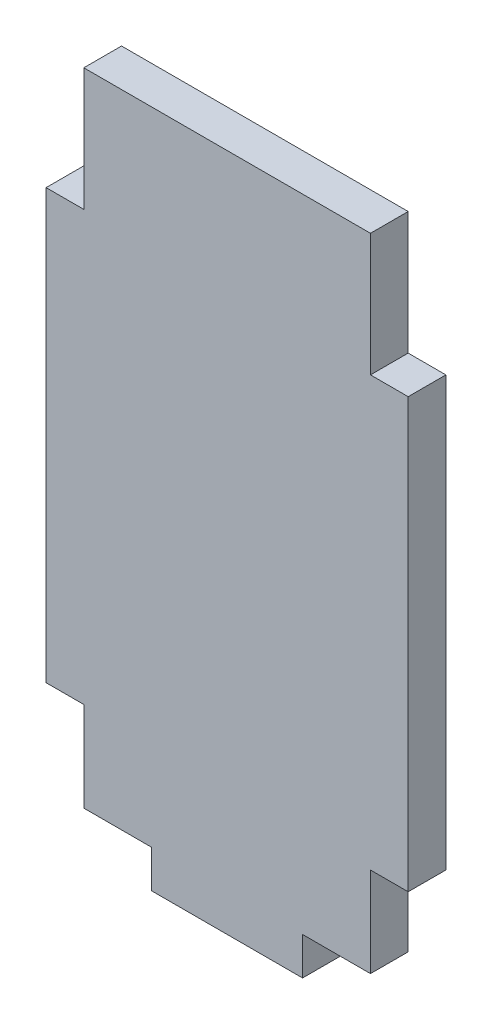
ISO-10303-21;
HEADER;
FILE_DESCRIPTION(('STEP AP214'),'2;1');
FILE_NAME('part.step','',(''),(''),'','','');
FILE_SCHEMA(('AUTOMOTIVE_DESIGN { 1 0 10303 214 1 1 1 1 }'));
ENDSEC;
DATA;
#1=APPLICATION_CONTEXT('core data for automotive mechanical design processes');
#2=APPLICATION_PROTOCOL_DEFINITION('international standard','automotive_design',2000,#1);
#3=PRODUCT_CONTEXT('',#1,'mechanical');
#4=PRODUCT('Part','Part','',(#3));
#5=PRODUCT_RELATED_PRODUCT_CATEGORY('part','',(#4));
#6=PRODUCT_DEFINITION_FORMATION('','',#4);
#7=PRODUCT_DEFINITION_CONTEXT('part definition',#1,'design');
#8=PRODUCT_DEFINITION('design','',#6,#7);
#9=PRODUCT_DEFINITION_SHAPE('','',#8);
#10=(LENGTH_UNIT() NAMED_UNIT(*) SI_UNIT(.MILLI.,.METRE.));
#11=(NAMED_UNIT(*) PLANE_ANGLE_UNIT() SI_UNIT($,.RADIAN.));
#12=(NAMED_UNIT(*) SI_UNIT($,.STERADIAN.) SOLID_ANGLE_UNIT());
#13=UNCERTAINTY_MEASURE_WITH_UNIT(LENGTH_MEASURE(1.E-05),#10,'distance_accuracy_value','');
#14=(GEOMETRIC_REPRESENTATION_CONTEXT(3) GLOBAL_UNCERTAINTY_ASSIGNED_CONTEXT((#13)) GLOBAL_UNIT_ASSIGNED_CONTEXT((#10,
#11,#12)) REPRESENTATION_CONTEXT('',''));
#15=CARTESIAN_POINT('',(0.,0.,0.));
#16=DIRECTION('',(0.,0.,1.));
#17=DIRECTION('',(1.,0.,0.));
#18=AXIS2_PLACEMENT_3D('',#15,#16,#17);
#19=CARTESIAN_POINT('',(0.,0.,5.));
#20=DIRECTION('',(1.,0.,0.));
#21=DIRECTION('',(0.,1.,0.));
#22=AXIS2_PLACEMENT_3D('',#19,#20,#21);
#23=PLANE('',#22);
#24=DIRECTION('',(0.,-1.,0.));
#25=VECTOR('',#24,1.);
#26=CARTESIAN_POINT('',(0.,0.,0.));
#27=LINE('',#26,#25);
#28=CARTESIAN_POINT('',(0.,13.643220338983,0.));
#29=VERTEX_POINT('',#28);
#30=CARTESIAN_POINT('',(0.,-2.61467439785904,0.));
#31=VERTEX_POINT('',#30);
#32=EDGE_CURVE('E176',#29,#31,#27,.T.);
#33=ORIENTED_EDGE('',*,*,#32,.F.);
#34=DIRECTION('',(0.,0.,-1.));
#35=VECTOR('',#34,1.);
#36=CARTESIAN_POINT('',(0.,13.643220338983,5.));
#37=LINE('',#36,#35);
#38=CARTESIAN_POINT('',(0.,13.643220338983,5.));
#39=VERTEX_POINT('',#38);
#40=EDGE_CURVE('E11',#39,#29,#37,.T.);
#41=ORIENTED_EDGE('',*,*,#40,.F.);
#42=DIRECTION('',(0.,-1.,0.));
#43=VECTOR('',#42,1.);
#44=CARTESIAN_POINT('',(0.,0.,5.));
#45=LINE('',#44,#43);
#46=CARTESIAN_POINT('',(0.,-2.61467439785904,5.));
#47=VERTEX_POINT('',#46);
#48=EDGE_CURVE('E211',#39,#47,#45,.T.);
#49=ORIENTED_EDGE('',*,*,#48,.T.);
#50=DIRECTION('',(0.,0.,-1.));
#51=VECTOR('',#50,1.);
#52=CARTESIAN_POINT('',(0.,-2.61467439785904,5.));
#53=LINE('',#52,#51);
#54=EDGE_CURVE('E110',#47,#31,#53,.T.);
#55=ORIENTED_EDGE('',*,*,#54,.T.);
#56=EDGE_LOOP('',(#33,#41,#49,#55));
#57=FACE_BOUND('',#56,.T.);
#58=ADVANCED_FACE('F35',(#57),#23,.T.);
#59=CARTESIAN_POINT('',(0.,13.643220338983,5.));
#60=DIRECTION('',(0.,1.,0.));
#61=DIRECTION('',(0.,0.,1.));
#62=AXIS2_PLACEMENT_3D('',#59,#60,#61);
#63=PLANE('',#62);
#64=DIRECTION('',(1.,0.,0.));
#65=VECTOR('',#64,1.);
#66=CARTESIAN_POINT('',(0.,13.643220338983,0.));
#67=LINE('',#66,#65);
#68=CARTESIAN_POINT('',(-38.,13.643220338983,0.));
#69=VERTEX_POINT('',#68);
#70=EDGE_CURVE('E179',#69,#29,#67,.T.);
#71=ORIENTED_EDGE('',*,*,#70,.F.);
#72=DIRECTION('',(0.,0.,-1.));
#73=VECTOR('',#72,1.);
#74=CARTESIAN_POINT('',(-38.,13.643220338983,5.));
#75=LINE('',#74,#73);
#76=CARTESIAN_POINT('',(-38.,13.643220338983,5.));
#77=VERTEX_POINT('',#76);
#78=EDGE_CURVE('E44',#77,#69,#75,.T.);
#79=ORIENTED_EDGE('',*,*,#78,.F.);
#80=DIRECTION('',(1.,0.,0.));
#81=VECTOR('',#80,1.);
#82=CARTESIAN_POINT('',(0.,13.643220338983,5.));
#83=LINE('',#82,#81);
#84=EDGE_CURVE('E252',#77,#39,#83,.T.);
#85=ORIENTED_EDGE('',*,*,#84,.T.);
#86=ORIENTED_EDGE('',*,*,#40,.T.);
#87=EDGE_LOOP('',(#71,#79,#85,#86));
#88=FACE_BOUND('',#87,.T.);
#89=ADVANCED_FACE('F37',(#88),#63,.T.);
#90=CARTESIAN_POINT('',(-38.,0.,5.));
#91=DIRECTION('',(1.,0.,0.));
#92=DIRECTION('',(0.,1.,0.));
#93=AXIS2_PLACEMENT_3D('',#90,#91,#92);
#94=PLANE('',#93);
#95=DIRECTION('',(0.,-1.,0.));
#96=VECTOR('',#95,1.);
#97=CARTESIAN_POINT('',(-38.,0.,0.));
#98=LINE('',#97,#96);
#99=CARTESIAN_POINT('',(-38.,-2.61467439785905,0.));
#100=VERTEX_POINT('',#99);
#101=EDGE_CURVE('E183',#69,#100,#98,.T.);
#102=ORIENTED_EDGE('',*,*,#101,.T.);
#103=DIRECTION('',(0.,0.,-1.));
#104=VECTOR('',#103,1.);
#105=CARTESIAN_POINT('',(-38.,-2.61467439785905,5.));
#106=LINE('',#105,#104);
#107=CARTESIAN_POINT('',(-38.,-2.61467439785905,5.));
#108=VERTEX_POINT('',#107);
#109=EDGE_CURVE('E236',#108,#100,#106,.T.);
#110=ORIENTED_EDGE('',*,*,#109,.F.);
#111=DIRECTION('',(0.,-1.,0.));
#112=VECTOR('',#111,1.);
#113=CARTESIAN_POINT('',(-38.,0.,5.));
#114=LINE('',#113,#112);
#115=EDGE_CURVE('E243',#77,#108,#114,.T.);
#116=ORIENTED_EDGE('',*,*,#115,.F.);
#117=ORIENTED_EDGE('',*,*,#78,.T.);
#118=EDGE_LOOP('',(#102,#110,#116,#117));
#119=FACE_BOUND('',#118,.T.);
#120=ADVANCED_FACE('F241',(#119),#94,.F.);
#121=CARTESIAN_POINT('',(0.,-2.61467439785904,5.));
#122=DIRECTION('',(0.,-1.,0.));
#123=DIRECTION('',(1.,0.,0.));
#124=AXIS2_PLACEMENT_3D('',#121,#122,#123);
#125=PLANE('',#124);
#126=DIRECTION('',(-1.,0.,0.));
#127=VECTOR('',#126,1.);
#128=CARTESIAN_POINT('',(0.,-2.61467439785904,0.));
#129=LINE('',#128,#127);
#130=CARTESIAN_POINT('',(-43.,-2.61467439785905,0.));
#131=VERTEX_POINT('',#130);
#132=EDGE_CURVE('E185',#100,#131,#129,.T.);
#133=ORIENTED_EDGE('',*,*,#132,.T.);
#134=DIRECTION('',(0.,0.,-1.));
#135=VECTOR('',#134,1.);
#136=CARTESIAN_POINT('',(-43.,-2.61467439785905,5.));
#137=LINE('',#136,#135);
#138=CARTESIAN_POINT('',(-43.,-2.61467439785905,5.));
#139=VERTEX_POINT('',#138);
#140=EDGE_CURVE('E233',#139,#131,#137,.T.);
#141=ORIENTED_EDGE('',*,*,#140,.F.);
#142=DIRECTION('',(-1.,0.,0.));
#143=VECTOR('',#142,1.);
#144=CARTESIAN_POINT('',(0.,-2.61467439785904,5.));
#145=LINE('',#144,#143);
#146=EDGE_CURVE('E280',#108,#139,#145,.T.);
#147=ORIENTED_EDGE('',*,*,#146,.F.);
#148=ORIENTED_EDGE('',*,*,#109,.T.);
#149=EDGE_LOOP('',(#133,#141,#147,#148));
#150=FACE_BOUND('',#149,.T.);
#151=ADVANCED_FACE('F350',(#150),#125,.F.);
#152=CARTESIAN_POINT('',(-43.,0.,5.));
#153=DIRECTION('',(1.,0.,0.));
#154=DIRECTION('',(0.,1.,0.));
#155=AXIS2_PLACEMENT_3D('',#152,#153,#154);
#156=PLANE('',#155);
#157=DIRECTION('',(0.,-1.,0.));
#158=VECTOR('',#157,1.);
#159=CARTESIAN_POINT('',(-43.,0.,0.));
#160=LINE('',#159,#158);
#161=CARTESIAN_POINT('',(-43.,-59.456779661017,0.));
#162=VERTEX_POINT('',#161);
#163=EDGE_CURVE('E188',#131,#162,#160,.T.);
#164=ORIENTED_EDGE('',*,*,#163,.T.);
#165=DIRECTION('',(0.,0.,-1.));
#166=VECTOR('',#165,1.);
#167=CARTESIAN_POINT('',(-43.,-59.456779661017,5.));
#168=LINE('',#167,#166);
#169=CARTESIAN_POINT('',(-43.,-59.456779661017,5.));
#170=VERTEX_POINT('',#169);
#171=EDGE_CURVE('E231',#170,#162,#168,.T.);
#172=ORIENTED_EDGE('',*,*,#171,.F.);
#173=DIRECTION('',(0.,-1.,0.));
#174=VECTOR('',#173,1.);
#175=CARTESIAN_POINT('',(-43.,0.,5.));
#176=LINE('',#175,#174);
#177=EDGE_CURVE('E278',#139,#170,#176,.T.);
#178=ORIENTED_EDGE('',*,*,#177,.F.);
#179=ORIENTED_EDGE('',*,*,#140,.T.);
#180=EDGE_LOOP('',(#164,#172,#178,#179));
#181=FACE_BOUND('',#180,.T.);
#182=ADVANCED_FACE('F287',(#181),#156,.F.);
#183=CARTESIAN_POINT('',(0.,-59.456779661017,5.));
#184=DIRECTION('',(0.,-1.,0.));
#185=DIRECTION('',(0.,0.,-1.));
#186=AXIS2_PLACEMENT_3D('',#183,#184,#185);
#187=PLANE('',#186);
#188=DIRECTION('',(-1.,0.,0.));
#189=VECTOR('',#188,1.);
#190=CARTESIAN_POINT('',(0.,-59.456779661017,0.));
#191=LINE('',#190,#189);
#192=CARTESIAN_POINT('',(-38.,-59.456779661017,0.));
#193=VERTEX_POINT('',#192);
#194=EDGE_CURVE('E191',#193,#162,#191,.T.);
#195=ORIENTED_EDGE('',*,*,#194,.F.);
#196=DIRECTION('',(0.,0.,-1.));
#197=VECTOR('',#196,1.);
#198=CARTESIAN_POINT('',(-38.,-59.456779661017,5.));
#199=LINE('',#198,#197);
#200=CARTESIAN_POINT('',(-38.,-59.456779661017,5.));
#201=VERTEX_POINT('',#200);
#202=EDGE_CURVE('E229',#201,#193,#199,.T.);
#203=ORIENTED_EDGE('',*,*,#202,.F.);
#204=DIRECTION('',(-1.,0.,0.));
#205=VECTOR('',#204,1.);
#206=CARTESIAN_POINT('',(0.,-59.456779661017,5.));
#207=LINE('',#206,#205);
#208=EDGE_CURVE('E272',#201,#170,#207,.T.);
#209=ORIENTED_EDGE('',*,*,#208,.T.);
#210=ORIENTED_EDGE('',*,*,#171,.T.);
#211=EDGE_LOOP('',(#195,#203,#209,#210));
#212=FACE_BOUND('',#211,.T.);
#213=ADVANCED_FACE('F290',(#212),#187,.T.);
#214=CARTESIAN_POINT('',(-38.,-71.356779661017,0.));
#215=VERTEX_POINT('',#214);
#216=EDGE_CURVE('E186',#193,#215,#98,.T.);
#217=ORIENTED_EDGE('',*,*,#216,.T.);
#218=DIRECTION('',(0.,0.,-1.));
#219=VECTOR('',#218,1.);
#220=CARTESIAN_POINT('',(-38.,-71.356779661017,5.));
#221=LINE('',#220,#219);
#222=CARTESIAN_POINT('',(-38.,-71.356779661017,5.));
#223=VERTEX_POINT('',#222);
#224=EDGE_CURVE('E226',#223,#215,#221,.T.);
#225=ORIENTED_EDGE('',*,*,#224,.F.);
#226=EDGE_CURVE('E269',#201,#223,#114,.T.);
#227=ORIENTED_EDGE('',*,*,#226,.F.);
#228=ORIENTED_EDGE('',*,*,#202,.T.);
#229=EDGE_LOOP('',(#217,#225,#227,#228));
#230=FACE_BOUND('',#229,.T.);
#231=ADVANCED_FACE('F293',(#230),#94,.F.);
#232=CARTESIAN_POINT('',(0.,-71.356779661017,5.));
#233=DIRECTION('',(0.,1.,0.));
#234=DIRECTION('',(0.,0.,1.));
#235=AXIS2_PLACEMENT_3D('',#232,#233,#234);
#236=PLANE('',#235);
#237=DIRECTION('',(1.,0.,0.));
#238=VECTOR('',#237,1.);
#239=CARTESIAN_POINT('',(0.,-71.356779661017,0.));
#240=LINE('',#239,#238);
#241=CARTESIAN_POINT('',(-29.,-71.356779661017,0.));
#242=VERTEX_POINT('',#241);
#243=EDGE_CURVE('E194',#215,#242,#240,.T.);
#244=ORIENTED_EDGE('',*,*,#243,.T.);
#245=DIRECTION('',(0.,0.,-1.));
#246=VECTOR('',#245,1.);
#247=CARTESIAN_POINT('',(-29.,-71.356779661017,5.));
#248=LINE('',#247,#246);
#249=CARTESIAN_POINT('',(-29.,-71.356779661017,5.));
#250=VERTEX_POINT('',#249);
#251=EDGE_CURVE('E223',#250,#242,#248,.T.);
#252=ORIENTED_EDGE('',*,*,#251,.F.);
#253=DIRECTION('',(1.,0.,0.));
#254=VECTOR('',#253,1.);
#255=CARTESIAN_POINT('',(0.,-71.356779661017,5.));
#256=LINE('',#255,#254);
#257=EDGE_CURVE('E260',#223,#250,#256,.T.);
#258=ORIENTED_EDGE('',*,*,#257,.F.);
#259=ORIENTED_EDGE('',*,*,#224,.T.);
#260=EDGE_LOOP('',(#244,#252,#258,#259));
#261=FACE_BOUND('',#260,.T.);
#262=ADVANCED_FACE('F296',(#261),#236,.F.);
#263=CARTESIAN_POINT('',(-29.,0.,5.));
#264=DIRECTION('',(1.,0.,0.));
#265=DIRECTION('',(0.,0.,-1.));
#266=AXIS2_PLACEMENT_3D('',#263,#264,#265);
#267=PLANE('',#266);
#268=DIRECTION('',(0.,-1.,0.));
#269=VECTOR('',#268,1.);
#270=CARTESIAN_POINT('',(-29.,0.,0.));
#271=LINE('',#270,#269);
#272=CARTESIAN_POINT('',(-29.,-76.356779661017,0.));
#273=VERTEX_POINT('',#272);
#274=EDGE_CURVE('E196',#242,#273,#271,.T.);
#275=ORIENTED_EDGE('',*,*,#274,.T.);
#276=DIRECTION('',(0.,0.,-1.));
#277=VECTOR('',#276,1.);
#278=CARTESIAN_POINT('',(-29.,-76.356779661017,5.));
#279=LINE('',#278,#277);
#280=CARTESIAN_POINT('',(-29.,-76.356779661017,5.));
#281=VERTEX_POINT('',#280);
#282=EDGE_CURVE('E221',#281,#273,#279,.T.);
#283=ORIENTED_EDGE('',*,*,#282,.F.);
#284=DIRECTION('',(0.,-1.,0.));
#285=VECTOR('',#284,1.);
#286=CARTESIAN_POINT('',(-29.,0.,5.));
#287=LINE('',#286,#285);
#288=EDGE_CURVE('E268',#250,#281,#287,.T.);
#289=ORIENTED_EDGE('',*,*,#288,.F.);
#290=ORIENTED_EDGE('',*,*,#251,.T.);
#291=EDGE_LOOP('',(#275,#283,#289,#290));
#292=FACE_BOUND('',#291,.T.);
#293=ADVANCED_FACE('F301',(#292),#267,.F.);
#294=CARTESIAN_POINT('',(0.,-76.356779661017,5.));
#295=DIRECTION('',(0.,-1.,0.));
#296=DIRECTION('',(0.,0.,-1.));
#297=AXIS2_PLACEMENT_3D('',#294,#295,#296);
#298=PLANE('',#297);
#299=DIRECTION('',(-1.,0.,0.));
#300=VECTOR('',#299,1.);
#301=CARTESIAN_POINT('',(0.,-76.356779661017,0.));
#302=LINE('',#301,#300);
#303=CARTESIAN_POINT('',(-9.,-76.356779661017,0.));
#304=VERTEX_POINT('',#303);
#305=EDGE_CURVE('E200',#304,#273,#302,.T.);
#306=ORIENTED_EDGE('',*,*,#305,.F.);
#307=DIRECTION('',(0.,0.,-1.));
#308=VECTOR('',#307,1.);
#309=CARTESIAN_POINT('',(-9.,-76.356779661017,5.));
#310=LINE('',#309,#308);
#311=CARTESIAN_POINT('',(-9.,-76.356779661017,5.));
#312=VERTEX_POINT('',#311);
#313=EDGE_CURVE('E219',#312,#304,#310,.T.);
#314=ORIENTED_EDGE('',*,*,#313,.F.);
#315=DIRECTION('',(-1.,0.,0.));
#316=VECTOR('',#315,1.);
#317=CARTESIAN_POINT('',(0.,-76.356779661017,5.));
#318=LINE('',#317,#316);
#319=EDGE_CURVE('E265',#312,#281,#318,.T.);
#320=ORIENTED_EDGE('',*,*,#319,.T.);
#321=ORIENTED_EDGE('',*,*,#282,.T.);
#322=EDGE_LOOP('',(#306,#314,#320,#321));
#323=FACE_BOUND('',#322,.T.);
#324=ADVANCED_FACE('F317',(#323),#298,.T.);
#325=CARTESIAN_POINT('',(-8.99999999999998,0.,5.));
#326=DIRECTION('',(1.,0.,0.));
#327=DIRECTION('',(0.,1.,0.));
#328=AXIS2_PLACEMENT_3D('',#325,#326,#327);
#329=PLANE('',#328);
#330=DIRECTION('',(0.,-1.,0.));
#331=VECTOR('',#330,1.);
#332=CARTESIAN_POINT('',(-8.99999999999998,0.,0.));
#333=LINE('',#332,#331);
#334=CARTESIAN_POINT('',(-9.,-71.356779661017,0.));
#335=VERTEX_POINT('',#334);
#336=EDGE_CURVE('E203',#335,#304,#333,.T.);
#337=ORIENTED_EDGE('',*,*,#336,.F.);
#338=DIRECTION('',(0.,0.,-1.));
#339=VECTOR('',#338,1.);
#340=CARTESIAN_POINT('',(-9.,-71.356779661017,5.));
#341=LINE('',#340,#339);
#342=CARTESIAN_POINT('',(-9.,-71.356779661017,5.));
#343=VERTEX_POINT('',#342);
#344=EDGE_CURVE('E217',#343,#335,#341,.T.);
#345=ORIENTED_EDGE('',*,*,#344,.F.);
#346=DIRECTION('',(0.,-1.,0.));
#347=VECTOR('',#346,1.);
#348=CARTESIAN_POINT('',(-8.99999999999998,0.,5.));
#349=LINE('',#348,#347);
#350=EDGE_CURVE('E258',#343,#312,#349,.T.);
#351=ORIENTED_EDGE('',*,*,#350,.T.);
#352=ORIENTED_EDGE('',*,*,#313,.T.);
#353=EDGE_LOOP('',(#337,#345,#351,#352));
#354=FACE_BOUND('',#353,.T.);
#355=ADVANCED_FACE('F308',(#354),#329,.T.);
#356=CARTESIAN_POINT('',(0.,-71.356779661017,0.));
#357=VERTEX_POINT('',#356);
#358=EDGE_CURVE('E197',#335,#357,#240,.T.);
#359=ORIENTED_EDGE('',*,*,#358,.T.);
#360=DIRECTION('',(0.,0.,-1.));
#361=VECTOR('',#360,1.);
#362=CARTESIAN_POINT('',(0.,-71.356779661017,5.));
#363=LINE('',#362,#361);
#364=CARTESIAN_POINT('',(0.,-71.356779661017,5.));
#365=VERTEX_POINT('',#364);
#366=EDGE_CURVE('E215',#365,#357,#363,.T.);
#367=ORIENTED_EDGE('',*,*,#366,.F.);
#368=EDGE_CURVE('E256',#343,#365,#256,.T.);
#369=ORIENTED_EDGE('',*,*,#368,.F.);
#370=ORIENTED_EDGE('',*,*,#344,.T.);
#371=EDGE_LOOP('',(#359,#367,#369,#370));
#372=FACE_BOUND('',#371,.T.);
#373=ADVANCED_FACE('F313',(#372),#236,.F.);
#374=CARTESIAN_POINT('',(0.,-59.456779661017,0.));
#375=VERTEX_POINT('',#374);
#376=EDGE_CURVE('E180',#375,#357,#27,.T.);
#377=ORIENTED_EDGE('',*,*,#376,.F.);
#378=DIRECTION('',(0.,0.,-1.));
#379=VECTOR('',#378,1.);
#380=CARTESIAN_POINT('',(0.,-59.456779661017,5.));
#381=LINE('',#380,#379);
#382=CARTESIAN_POINT('',(0.,-59.456779661017,5.));
#383=VERTEX_POINT('',#382);
#384=EDGE_CURVE('E163',#383,#375,#381,.T.);
#385=ORIENTED_EDGE('',*,*,#384,.F.);
#386=EDGE_CURVE('E169',#383,#365,#45,.T.);
#387=ORIENTED_EDGE('',*,*,#386,.T.);
#388=ORIENTED_EDGE('',*,*,#366,.T.);
#389=EDGE_LOOP('',(#377,#385,#387,#388));
#390=FACE_BOUND('',#389,.T.);
#391=ADVANCED_FACE('F316',(#390),#23,.T.);
#392=CARTESIAN_POINT('',(0.,-59.456779661017,5.));
#393=DIRECTION('',(0.,-1.,0.));
#394=DIRECTION('',(0.,0.,-1.));
#395=AXIS2_PLACEMENT_3D('',#392,#393,#394);
#396=PLANE('',#395);
#397=DIRECTION('',(-1.,0.,0.));
#398=VECTOR('',#397,1.);
#399=CARTESIAN_POINT('',(0.,-59.456779661017,0.));
#400=LINE('',#399,#398);
#401=CARTESIAN_POINT('',(5.00000000000002,-59.456779661017,0.));
#402=VERTEX_POINT('',#401);
#403=EDGE_CURVE('E158',#402,#375,#400,.T.);
#404=ORIENTED_EDGE('',*,*,#403,.F.);
#405=DIRECTION('',(0.,0.,-1.));
#406=VECTOR('',#405,1.);
#407=CARTESIAN_POINT('',(5.00000000000002,-59.456779661017,5.));
#408=LINE('',#407,#406);
#409=CARTESIAN_POINT('',(5.00000000000002,-59.456779661017,5.));
#410=VERTEX_POINT('',#409);
#411=EDGE_CURVE('E153',#410,#402,#408,.T.);
#412=ORIENTED_EDGE('',*,*,#411,.F.);
#413=DIRECTION('',(-1.,0.,0.));
#414=VECTOR('',#413,1.);
#415=CARTESIAN_POINT('',(0.,-59.456779661017,5.));
#416=LINE('',#415,#414);
#417=EDGE_CURVE('E156',#410,#383,#416,.T.);
#418=ORIENTED_EDGE('',*,*,#417,.T.);
#419=ORIENTED_EDGE('',*,*,#384,.T.);
#420=EDGE_LOOP('',(#404,#412,#418,#419));
#421=FACE_BOUND('',#420,.T.);
#422=ADVANCED_FACE('F155',(#421),#396,.T.);
#423=CARTESIAN_POINT('',(5.00000000000001,0.,5.));
#424=DIRECTION('',(1.,0.,0.));
#425=DIRECTION('',(0.,1.,0.));
#426=AXIS2_PLACEMENT_3D('',#423,#424,#425);
#427=PLANE('',#426);
#428=DIRECTION('',(0.,-1.,0.));
#429=VECTOR('',#428,1.);
#430=CARTESIAN_POINT('',(5.00000000000001,0.,0.));
#431=LINE('',#430,#429);
#432=CARTESIAN_POINT('',(5.00000000000001,-2.61467439785904,0.));
#433=VERTEX_POINT('',#432);
#434=EDGE_CURVE('E207',#433,#402,#431,.T.);
#435=ORIENTED_EDGE('',*,*,#434,.F.);
#436=DIRECTION('',(0.,0.,-1.));
#437=VECTOR('',#436,1.);
#438=CARTESIAN_POINT('',(5.00000000000001,-2.61467439785904,5.));
#439=LINE('',#438,#437);
#440=CARTESIAN_POINT('',(5.00000000000001,-2.61467439785904,5.));
#441=VERTEX_POINT('',#440);
#442=EDGE_CURVE('E103',#441,#433,#439,.T.);
#443=ORIENTED_EDGE('',*,*,#442,.F.);
#444=DIRECTION('',(0.,-1.,0.));
#445=VECTOR('',#444,1.);
#446=CARTESIAN_POINT('',(5.00000000000001,0.,5.));
#447=LINE('',#446,#445);
#448=EDGE_CURVE('E167',#441,#410,#447,.T.);
#449=ORIENTED_EDGE('',*,*,#448,.T.);
#450=ORIENTED_EDGE('',*,*,#411,.T.);
#451=EDGE_LOOP('',(#435,#443,#449,#450));
#452=FACE_BOUND('',#451,.T.);
#453=ADVANCED_FACE('F171',(#452),#427,.T.);
#454=CARTESIAN_POINT('',(0.,-2.61467439785904,5.));
#455=DIRECTION('',(0.,-1.,0.));
#456=DIRECTION('',(1.,0.,0.));
#457=AXIS2_PLACEMENT_3D('',#454,#455,#456);
#458=PLANE('',#457);
#459=DIRECTION('',(-1.,0.,0.));
#460=VECTOR('',#459,1.);
#461=CARTESIAN_POINT('',(0.,-2.61467439785904,0.));
#462=LINE('',#461,#460);
#463=EDGE_CURVE('E209',#433,#31,#462,.T.);
#464=ORIENTED_EDGE('',*,*,#463,.T.);
#465=ORIENTED_EDGE('',*,*,#54,.F.);
#466=DIRECTION('',(-1.,0.,0.));
#467=VECTOR('',#466,1.);
#468=CARTESIAN_POINT('',(0.,-2.61467439785904,5.));
#469=LINE('',#468,#467);
#470=EDGE_CURVE('E52',#441,#47,#469,.T.);
#471=ORIENTED_EDGE('',*,*,#470,.F.);
#472=ORIENTED_EDGE('',*,*,#442,.T.);
#473=EDGE_LOOP('',(#464,#465,#471,#472));
#474=FACE_BOUND('',#473,.T.);
#475=ADVANCED_FACE('F253',(#474),#458,.F.);
#476=CARTESIAN_POINT('',(0.,0.,5.));
#477=DIRECTION('',(0.,0.,1.));
#478=DIRECTION('',(1.,0.,0.));
#479=AXIS2_PLACEMENT_3D('',#476,#477,#478);
#480=PLANE('',#479);
#481=ORIENTED_EDGE('',*,*,#48,.F.);
#482=ORIENTED_EDGE('',*,*,#84,.F.);
#483=ORIENTED_EDGE('',*,*,#115,.T.);
#484=ORIENTED_EDGE('',*,*,#146,.T.);
#485=ORIENTED_EDGE('',*,*,#177,.T.);
#486=ORIENTED_EDGE('',*,*,#208,.F.);
#487=ORIENTED_EDGE('',*,*,#226,.T.);
#488=ORIENTED_EDGE('',*,*,#257,.T.);
#489=ORIENTED_EDGE('',*,*,#288,.T.);
#490=ORIENTED_EDGE('',*,*,#319,.F.);
#491=ORIENTED_EDGE('',*,*,#350,.F.);
#492=ORIENTED_EDGE('',*,*,#368,.T.);
#493=ORIENTED_EDGE('',*,*,#386,.F.);
#494=ORIENTED_EDGE('',*,*,#417,.F.);
#495=ORIENTED_EDGE('',*,*,#448,.F.);
#496=ORIENTED_EDGE('',*,*,#470,.T.);
#497=EDGE_LOOP('',(#481,#482,#483,#484,#485,#486,#487,#488,#489,#490,#491,#492,#493,#494,#495,#496));
#498=FACE_BOUND('',#497,.T.);
#499=ADVANCED_FACE('F166',(#498),#480,.T.);
#500=CARTESIAN_POINT('',(0.,0.,0.));
#501=DIRECTION('',(0.,0.,1.));
#502=DIRECTION('',(1.,0.,0.));
#503=AXIS2_PLACEMENT_3D('',#500,#501,#502);
#504=PLANE('',#503);
#505=ORIENTED_EDGE('',*,*,#32,.T.);
#506=ORIENTED_EDGE('',*,*,#463,.F.);
#507=ORIENTED_EDGE('',*,*,#434,.T.);
#508=ORIENTED_EDGE('',*,*,#403,.T.);
#509=ORIENTED_EDGE('',*,*,#376,.T.);
#510=ORIENTED_EDGE('',*,*,#358,.F.);
#511=ORIENTED_EDGE('',*,*,#336,.T.);
#512=ORIENTED_EDGE('',*,*,#305,.T.);
#513=ORIENTED_EDGE('',*,*,#274,.F.);
#514=ORIENTED_EDGE('',*,*,#243,.F.);
#515=ORIENTED_EDGE('',*,*,#216,.F.);
#516=ORIENTED_EDGE('',*,*,#194,.T.);
#517=ORIENTED_EDGE('',*,*,#163,.F.);
#518=ORIENTED_EDGE('',*,*,#132,.F.);
#519=ORIENTED_EDGE('',*,*,#101,.F.);
#520=ORIENTED_EDGE('',*,*,#70,.T.);
#521=EDGE_LOOP('',(#505,#506,#507,#508,#509,#510,#511,#512,#513,#514,#515,#516,#517,#518,#519,#520));
#522=FACE_BOUND('',#521,.T.);
#523=ADVANCED_FACE('F250',(#522),#504,.F.);
#524=CLOSED_SHELL('',(#58,#89,#120,#151,#182,#213,#231,#262,#293,#324,#355,#373,#391,#422,#453,
#475,#499,#523));
#525=MANIFOLD_SOLID_BREP('B2',#524);
#526=ADVANCED_BREP_SHAPE_REPRESENTATION('',(#18,#525),#14);
#527=SHAPE_DEFINITION_REPRESENTATION(#9,#526);
ENDSEC;
END-ISO-10303-21;
